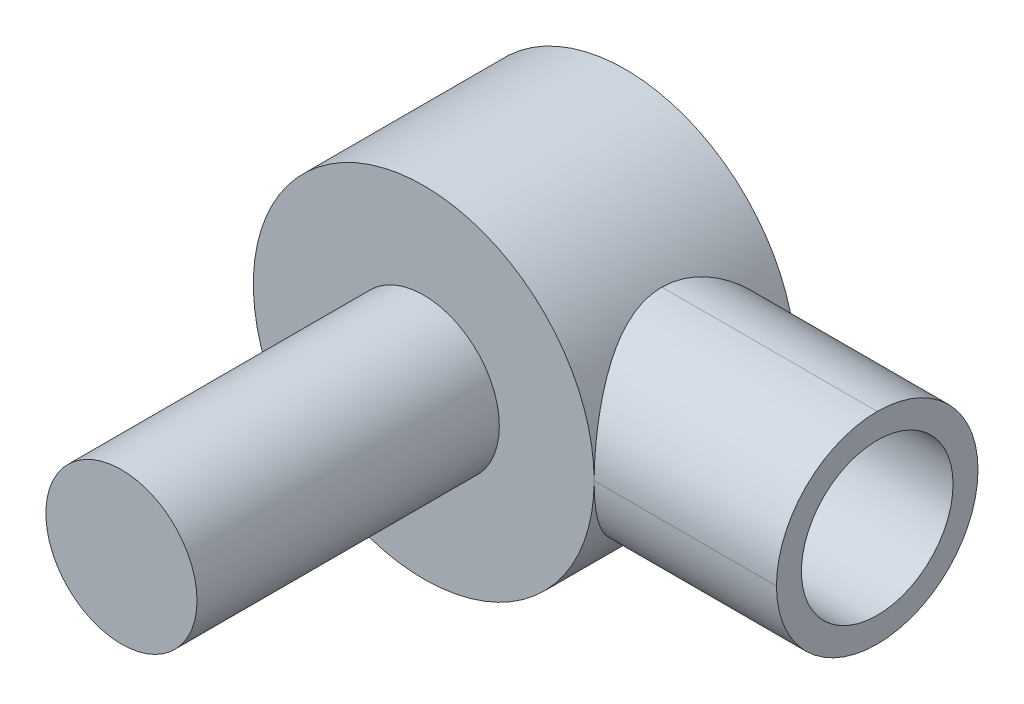
ISO-10303-21;
HEADER;
FILE_DESCRIPTION(('STEP AP214'),'2;1');
FILE_NAME('part.step','',(''),(''),'','','');
FILE_SCHEMA(('AUTOMOTIVE_DESIGN { 1 0 10303 214 1 1 1 1 }'));
ENDSEC;
DATA;
#1=APPLICATION_CONTEXT('core data for automotive mechanical design processes');
#2=APPLICATION_PROTOCOL_DEFINITION('international standard','automotive_design',2000,#1);
#3=PRODUCT_CONTEXT('',#1,'mechanical');
#4=PRODUCT('Part','Part','',(#3));
#5=PRODUCT_RELATED_PRODUCT_CATEGORY('part','',(#4));
#6=PRODUCT_DEFINITION_FORMATION('','',#4);
#7=PRODUCT_DEFINITION_CONTEXT('part definition',#1,'design');
#8=PRODUCT_DEFINITION('design','',#6,#7);
#9=PRODUCT_DEFINITION_SHAPE('','',#8);
#10=(LENGTH_UNIT() NAMED_UNIT(*) SI_UNIT(.MILLI.,.METRE.));
#11=(NAMED_UNIT(*) PLANE_ANGLE_UNIT() SI_UNIT($,.RADIAN.));
#12=(NAMED_UNIT(*) SI_UNIT($,.STERADIAN.) SOLID_ANGLE_UNIT());
#13=UNCERTAINTY_MEASURE_WITH_UNIT(LENGTH_MEASURE(1.E-05),#10,'distance_accuracy_value','');
#14=(GEOMETRIC_REPRESENTATION_CONTEXT(3) GLOBAL_UNCERTAINTY_ASSIGNED_CONTEXT((#13)) GLOBAL_UNIT_ASSIGNED_CONTEXT((#10,
#11,#12)) REPRESENTATION_CONTEXT('',''));
#15=CARTESIAN_POINT('',(0.,0.,0.));
#16=DIRECTION('',(0.,0.,1.));
#17=DIRECTION('',(1.,0.,0.));
#18=AXIS2_PLACEMENT_3D('',#15,#16,#17);
#19=CARTESIAN_POINT('',(0.,0.,40.));
#20=DIRECTION('',(0.,0.,-1.));
#21=DIRECTION('',(-1.,0.,0.));
#22=AXIS2_PLACEMENT_3D('',#19,#20,#21);
#23=CYLINDRICAL_SURFACE('',#22,33.8186029261209);
#24=CARTESIAN_POINT('',(0.,0.,0.));
#25=DIRECTION('',(0.,0.,1.));
#26=DIRECTION('',(1.,0.,0.));
#27=AXIS2_PLACEMENT_3D('',#24,#25,#26);
#28=CIRCLE('',#27,33.8186029261209);
#29=CARTESIAN_POINT('',(33.8186029261209,0.,0.));
#30=VERTEX_POINT('',#29);
#31=EDGE_CURVE('E154',#30,#30,#28,.T.);
#32=ORIENTED_EDGE('',*,*,#31,.T.);
#33=CARTESIAN_POINT('',(33.8186029261209,0.,0.));
#34=CARTESIAN_POINT('',(33.8186063139391,-0.25776699889446,-1.88466073996932E-06));
#35=CARTESIAN_POINT('',(33.815654911843,-0.515498315282241,0.00498439253877558));
#36=CARTESIAN_POINT('',(33.8038815276497,-1.03043415682597,0.0249006114852887));
#37=CARTESIAN_POINT('',(33.7950597317006,-1.28763869842637,0.0398302379321435));
#38=CARTESIAN_POINT('',(33.7598641380628,-2.05742803039325,0.0994565403110367));
#39=CARTESIAN_POINT('',(33.7247600194719,-2.56856692445829,0.1589907422178));
#40=CARTESIAN_POINT('',(33.6324067464493,-3.57990496489912,0.316380231148131));
#41=CARTESIAN_POINT('',(33.575279154111,-4.08014851001001,0.414025195806914));
#42=CARTESIAN_POINT('',(33.4402600171058,-5.06912059187119,0.646395005441228));
#43=CARTESIAN_POINT('',(33.3623667849085,-5.55784818925737,0.781122864005987));
#44=CARTESIAN_POINT('',(33.1877834253281,-6.51978084000784,1.08580910333183));
#45=CARTESIAN_POINT('',(33.091124761791,-6.99301034786946,1.25570854337457));
#46=CARTESIAN_POINT('',(32.8810645415854,-7.92214483127294,1.62909044704063));
#47=CARTESIAN_POINT('',(32.7676630837697,-8.37804990908172,1.83257271238505));
#48=CARTESIAN_POINT('',(32.5263645156286,-9.27079072195125,2.27148845490724));
#49=CARTESIAN_POINT('',(32.3984527762947,-9.70760658603742,2.50695422533724));
#50=CARTESIAN_POINT('',(32.1307690735315,-10.5598832180313,3.00784812341752));
#51=CARTESIAN_POINT('',(31.9909965864533,-10.9753430417737,3.27327757412755));
#52=CARTESIAN_POINT('',(31.6915064867369,-11.8135014824101,3.85317831489119));
#53=CARTESIAN_POINT('',(31.5310786558176,-12.2344384329873,4.16982915988945));
#54=CARTESIAN_POINT('',(31.2030351308728,-13.0484131249434,4.833761094733));
#55=CARTESIAN_POINT('',(31.035419137841,-13.4414497039399,5.18104345939547));
#56=CARTESIAN_POINT('',(30.6963483785574,-14.1987473839189,5.90495464921777));
#57=CARTESIAN_POINT('',(30.524889053362,-14.562971706633,6.28161980121685));
#58=CARTESIAN_POINT('',(30.1820633322389,-15.260803164374,7.06237801452643));
#59=CARTESIAN_POINT('',(30.0106969420587,-15.5944085821224,7.46647261202433));
#60=CARTESIAN_POINT('',(29.6517530778015,-16.267567348724,8.3505084828866));
#61=CARTESIAN_POINT('',(29.4646820351066,-16.6030779430779,8.83374578839583));
#62=CARTESIAN_POINT('',(29.1014050650886,-17.2318900234099,9.83095616568657));
#63=CARTESIAN_POINT('',(28.9252007037354,-17.5251854339509,10.3449336464321));
#64=CARTESIAN_POINT('',(28.5904123848628,-18.0661880604738,11.3998168071126));
#65=CARTESIAN_POINT('',(28.4317777900834,-18.3140277131055,11.9406382316603));
#66=CARTESIAN_POINT('',(28.1380111629385,-18.7622530233496,13.0477193902187));
#67=CARTESIAN_POINT('',(28.0028724228477,-18.9626522304471,13.6139718057707));
#68=CARTESIAN_POINT('',(27.7863101370791,-19.2781703079288,14.6534328964886));
#69=CARTESIAN_POINT('',(27.699548896213,-19.4023211038447,15.1228000936451));
#70=CARTESIAN_POINT('',(27.5481852884861,-19.6166420157242,16.0726262582399));
#71=CARTESIAN_POINT('',(27.4835756945502,-19.7068232153717,16.5530815534309));
#72=CARTESIAN_POINT('',(27.378557666031,-19.8524732950242,17.5255950787775));
#73=CARTESIAN_POINT('',(27.33833014718,-19.9076828169868,18.0177125531445));
#74=CARTESIAN_POINT('',(27.2979208610966,-19.9630125973366,18.7591386489672));
#75=CARTESIAN_POINT('',(27.2877730001433,-19.9768751605122,19.0069774505578));
#76=CARTESIAN_POINT('',(27.2742210112628,-19.9953705234567,19.5031987405952));
#77=CARTESIAN_POINT('',(27.2708173153371,-20.0000027319701,19.7515812628501));
#78=CARTESIAN_POINT('',(27.2708251410666,-20.,20.));
#79=B_SPLINE_CURVE_WITH_KNOTS('',3,(#33,#34,#35,#36,#37,#38,#39,#40,#41,#42,#43,#44,#45,#46,#47,
#48,#49,#50,#51,#52,#53,#54,#55,#56,#57,#58,#59,#60,#61,#62,#63,#64,#65,#66,#67,#68,#69,#70,#71,
#72,#73,#74,#75,#76,#77,#78),.UNSPECIFIED.,.F.,.F.,(4,2,2,2,2,2,2,2,2,2,2,2,2,2,2,2,2,2,2,2,2,2,
4),(0.,0.773165214770627,1.54630591390868,3.09145624368039,4.62819723520834,6.16506314886758,
7.69937412632536,9.23367604526574,10.7695388031308,12.3054694042512,13.9556876723422,
15.6059746513603,17.2583352912175,18.9107885480857,20.7604760847301,22.6104295552646,
24.4549044074197,26.2988518210551,27.7767890913243,29.2542437179994,30.7425310146718,
31.4876018301169,32.2327203699625),.UNSPECIFIED.);
#80=CARTESIAN_POINT('',(27.2708251410666,-20.,20.));
#81=VERTEX_POINT('',#80);
#82=EDGE_CURVE('E51',#30,#81,#79,.T.);
#83=ORIENTED_EDGE('',*,*,#82,.T.);
#84=CARTESIAN_POINT('',(27.2708251410666,-20.,20.));
#85=CARTESIAN_POINT('',(27.2708115282266,-20.0000073233572,20.2537436016112));
#86=CARTESIAN_POINT('',(27.2743662838379,-19.9951712225496,20.507481450513));
#87=CARTESIAN_POINT('',(27.2885118520192,-19.9758676061996,21.0143775972179));
#88=CARTESIAN_POINT('',(27.2991021931013,-19.9614007360605,21.2675359327161));
#89=CARTESIAN_POINT('',(27.3272053645611,-19.9229086871384,21.7725071372583));
#90=CARTESIAN_POINT('',(27.344711827465,-19.8988923001883,22.0243210285676));
#91=CARTESIAN_POINT('',(27.3864464047122,-19.8414138645623,22.5262905712664));
#92=CARTESIAN_POINT('',(27.4106745916582,-19.8079517138607,22.7764462047148));
#93=CARTESIAN_POINT('',(27.4926461466494,-19.6941910283406,23.5197432003869));
#94=CARTESIAN_POINT('',(27.5599132367885,-19.6002002227865,24.0098359745086));
#95=CARTESIAN_POINT('',(27.717342127972,-19.3769296715116,24.97811959276));
#96=CARTESIAN_POINT('',(27.8075083141183,-19.2476431664238,25.4563081379889));
#97=CARTESIAN_POINT('',(28.0071594100242,-18.9559493738512,26.396350642611));
#98=CARTESIAN_POINT('',(28.1165744128303,-18.7936616170848,26.8582566860012));
#99=CARTESIAN_POINT('',(28.3514871204776,-18.4373690186328,27.7653665928241));
#100=CARTESIAN_POINT('',(28.4769843713376,-18.2433650722119,28.2105709272662));
#101=CARTESIAN_POINT('',(28.7408435530804,-17.8247896251393,29.0835962338778));
#102=CARTESIAN_POINT('',(28.8792318092712,-17.6001551187363,29.5113789514697));
#103=CARTESIAN_POINT('',(29.1652294004405,-17.1220587849712,30.3473184286224));
#104=CARTESIAN_POINT('',(29.3128397551433,-16.8685937671522,30.7554730089596));
#105=CARTESIAN_POINT('',(29.631689313486,-16.3027100860229,31.5977766357931));
#106=CARTESIAN_POINT('',(29.8036671852469,-15.9868637585118,32.0293463632246));
#107=CARTESIAN_POINT('',(30.1506950278238,-15.3223372393904,32.8651095030316));
#108=CARTESIAN_POINT('',(30.3257451776135,-14.9736551297507,33.2693013138129));
#109=CARTESIAN_POINT('',(30.6748915022836,-14.2447284695471,34.0489354497067));
#110=CARTESIAN_POINT('',(30.8489872784771,-13.8644716623362,34.4243665007362));
#111=CARTESIAN_POINT('',(31.1922583424306,-13.073892380573,35.1446128981693));
#112=CARTESIAN_POINT('',(31.3614334257222,-12.6635686591432,35.4894269735714));
#113=CARTESIAN_POINT('',(31.7084320247216,-11.7697273913774,36.1810199454718));
#114=CARTESIAN_POINT('',(31.8853000659109,-11.283047543529,36.5242077547018));
#115=CARTESIAN_POINT('',(32.223615720533,-10.2770668388292,37.167949608916));
#116=CARTESIAN_POINT('',(32.3850615425951,-9.75776220402501,37.4684987031551));
#117=CARTESIAN_POINT('',(32.6876059855482,-8.69053195681059,38.0231967186829));
#118=CARTESIAN_POINT('',(32.828741879366,-8.14266135383447,38.2774308716543));
#119=CARTESIAN_POINT('',(33.0867115962224,-7.02126322865272,38.7368284262491));
#120=CARTESIAN_POINT('',(33.2035517657777,-6.44774245445564,38.9420046448648));
#121=CARTESIAN_POINT('',(33.3888866754856,-5.39507621509767,39.2648287279545));
#122=CARTESIAN_POINT('',(33.4623716867518,-4.91963546663847,39.391758950467));
#123=CARTESIAN_POINT('',(33.5896575472743,-3.95825792909211,39.6105872467593));
#124=CARTESIAN_POINT('',(33.6434630692832,-3.47232366067413,39.7024936369126));
#125=CARTESIAN_POINT('',(33.7303764282521,-2.4906765444365,39.8505420675305));
#126=CARTESIAN_POINT('',(33.7633817768267,-1.99492750141638,39.9065070397478));
#127=CARTESIAN_POINT('',(33.7964710786717,-1.24846223527741,39.9625586302441));
#128=CARTESIAN_POINT('',(33.8047644212312,-0.99906455713327,39.9765932084778));
#129=CARTESIAN_POINT('',(33.8158319567523,-0.499788666486304,39.9953149147782));
#130=CARTESIAN_POINT('',(33.8186059762608,-0.249910439128488,40.0000017490779));
#131=CARTESIAN_POINT('',(33.8186029261209,0.,40.));
#132=B_SPLINE_CURVE_WITH_KNOTS('',3,(#84,#85,#86,#87,#88,#89,#90,#91,#92,#93,#94,#95,#96,#97,
#98,#99,#100,#101,#102,#103,#104,#105,#106,#107,#108,#109,#110,#111,#112,#113,#114,#115,#116,
#117,#118,#119,#120,#121,#122,#123,#124,#125,#126,#127,#128,#129,#130,#131),.UNSPECIFIED.,.F.,
.F.,(4,2,2,2,2,2,2,2,2,2,2,2,2,2,2,2,2,2,2,2,2,2,2,4),(0.,0.761149801873973,1.5222486006421,
2.2826483046295,3.04305622216349,4.55149762812459,6.06022811378575,7.56358830748777,
9.06690607260863,10.5733641042711,12.0799890068562,13.7636118352679,15.447333069846,
17.131710973438,18.8161587679009,20.6773735625232,22.5388042846645,24.3967740964242,
26.2542579588753,27.7452693266807,29.2359264344242,30.733872160278,31.4834567603645,
32.2330649169247),.UNSPECIFIED.);
#133=CARTESIAN_POINT('',(33.8186029261209,0.,40.));
#134=VERTEX_POINT('',#133);
#135=EDGE_CURVE('E109',#81,#134,#132,.T.);
#136=ORIENTED_EDGE('',*,*,#135,.T.);
#137=CARTESIAN_POINT('',(0.,0.,40.));
#138=DIRECTION('',(0.,0.,1.));
#139=DIRECTION('',(1.,0.,0.));
#140=AXIS2_PLACEMENT_3D('',#137,#138,#139);
#141=CIRCLE('',#140,33.8186029261209);
#142=EDGE_CURVE('E158',#134,#134,#141,.T.);
#143=ORIENTED_EDGE('',*,*,#142,.F.);
#144=CARTESIAN_POINT('',(33.8186029261209,0.,40.));
#145=CARTESIAN_POINT('',(33.8186063139391,0.257766998894465,40.0000018846607));
#146=CARTESIAN_POINT('',(33.815654911843,0.515498315282246,39.9950156074612));
#147=CARTESIAN_POINT('',(33.8038815276497,1.03043415682598,39.9750993885147));
#148=CARTESIAN_POINT('',(33.7950597317006,1.28763869842638,39.9601697620679));
#149=CARTESIAN_POINT('',(33.7598641380628,2.05742803039325,39.900543459689));
#150=CARTESIAN_POINT('',(33.7247600194719,2.5685669244583,39.8410092577822));
#151=CARTESIAN_POINT('',(33.6324067464493,3.57990496489913,39.6836197688519));
#152=CARTESIAN_POINT('',(33.575279154111,4.08014851001001,39.5859748041931));
#153=CARTESIAN_POINT('',(33.4402600171058,5.06912059187119,39.3536049945588));
#154=CARTESIAN_POINT('',(33.3623667849085,5.55784818925738,39.218877135994));
#155=CARTESIAN_POINT('',(33.1877834253281,6.51978084000785,38.9141908966682));
#156=CARTESIAN_POINT('',(33.091124761791,6.99301034786947,38.7442914566254));
#157=CARTESIAN_POINT('',(32.8810645415854,7.92214483127294,38.3709095529594));
#158=CARTESIAN_POINT('',(32.7676630837697,8.37804990908173,38.1674272876149));
#159=CARTESIAN_POINT('',(32.5263645156286,9.27079072195126,37.7285115450928));
#160=CARTESIAN_POINT('',(32.3984527762947,9.70760658603743,37.4930457746628));
#161=CARTESIAN_POINT('',(32.1307690735315,10.5598832180313,36.9921518765825));
#162=CARTESIAN_POINT('',(31.9909965864533,10.9753430417737,36.7267224258725));
#163=CARTESIAN_POINT('',(31.6915064867369,11.8135014824101,36.1468216851088));
#164=CARTESIAN_POINT('',(31.5310786558176,12.2344384329873,35.8301708401105));
#165=CARTESIAN_POINT('',(31.2030351308728,13.0484131249434,35.166238905267));
#166=CARTESIAN_POINT('',(31.035419137841,13.4414497039399,34.8189565406045));
#167=CARTESIAN_POINT('',(30.6963483785574,14.1987473839189,34.0950453507822));
#168=CARTESIAN_POINT('',(30.524889053362,14.562971706633,33.7183801987832));
#169=CARTESIAN_POINT('',(30.1820633322389,15.260803164374,32.9376219854736));
#170=CARTESIAN_POINT('',(30.0106969420588,15.5944085821224,32.5335273879757));
#171=CARTESIAN_POINT('',(29.6517530778015,16.267567348724,31.6494915171134));
#172=CARTESIAN_POINT('',(29.4646820351066,16.6030779430779,31.1662542116042));
#173=CARTESIAN_POINT('',(29.1014050650886,17.2318900234099,30.1690438343134));
#174=CARTESIAN_POINT('',(28.9252007037354,17.5251854339509,29.6550663535679));
#175=CARTESIAN_POINT('',(28.5904123848628,18.0661880604738,28.6001831928874));
#176=CARTESIAN_POINT('',(28.4317777900834,18.3140277131055,28.0593617683397));
#177=CARTESIAN_POINT('',(28.1380111629385,18.7622530233496,26.9522806097813));
#178=CARTESIAN_POINT('',(28.0028724228477,18.9626522304471,26.3860281942293));
#179=CARTESIAN_POINT('',(27.7863101370791,19.2781703079288,25.3465671035114));
#180=CARTESIAN_POINT('',(27.699548896213,19.4023211038447,24.877199906355));
#181=CARTESIAN_POINT('',(27.5481852884861,19.6166420157242,23.9273737417601));
#182=CARTESIAN_POINT('',(27.4835756945502,19.7068232153717,23.4469184465691));
#183=CARTESIAN_POINT('',(27.378557666031,19.8524732950242,22.4744049212225));
#184=CARTESIAN_POINT('',(27.33833014718,19.9076828169868,21.9822874468555));
#185=CARTESIAN_POINT('',(27.2979208610966,19.9630125973366,21.2408613510328));
#186=CARTESIAN_POINT('',(27.2877730001433,19.9768751605122,20.9930225494422));
#187=CARTESIAN_POINT('',(27.2742210112628,19.9953705234567,20.4968012594048));
#188=CARTESIAN_POINT('',(27.2708173153371,20.0000027319701,20.2484187371499));
#189=CARTESIAN_POINT('',(27.2708251410666,20.,20.));
#190=B_SPLINE_CURVE_WITH_KNOTS('',3,(#144,#145,#146,#147,#148,#149,#150,#151,#152,#153,#154,
#155,#156,#157,#158,#159,#160,#161,#162,#163,#164,#165,#166,#167,#168,#169,#170,#171,#172,#173,
#174,#175,#176,#177,#178,#179,#180,#181,#182,#183,#184,#185,#186,#187,#188,#189),.UNSPECIFIED.,
.F.,.F.,(4,2,2,2,2,2,2,2,2,2,2,2,2,2,2,2,2,2,2,2,2,2,4),(0.,0.773165214770628,1.54630591390869,
3.09145624368039,4.62819723520834,6.16506314886758,7.69937412632536,9.23367604526574,
10.7695388031308,12.3054694042512,13.9556876723422,15.6059746513603,17.2583352912175,
18.9107885480857,20.7604760847301,22.6104295552646,24.4549044074197,26.2988518210551,
27.7767890913243,29.2542437179994,30.7425310146718,31.487601830117,32.2327203699625),.UNSPECIFIED.);
#191=CARTESIAN_POINT('',(27.2708251410666,20.,20.));
#192=VERTEX_POINT('',#191);
#193=EDGE_CURVE('E92',#134,#192,#190,.T.);
#194=ORIENTED_EDGE('',*,*,#193,.T.);
#195=CARTESIAN_POINT('',(27.2708251410666,20.,20.));
#196=CARTESIAN_POINT('',(27.2708115282266,20.0000073233572,19.7462563983889));
#197=CARTESIAN_POINT('',(27.2743662838379,19.9951712225496,19.492518549487));
#198=CARTESIAN_POINT('',(27.2885118520192,19.9758676061996,18.9856224027821));
#199=CARTESIAN_POINT('',(27.2991021931013,19.9614007360605,18.7324640672839));
#200=CARTESIAN_POINT('',(27.3272053645611,19.9229086871384,18.2274928627417));
#201=CARTESIAN_POINT('',(27.344711827465,19.8988923001883,17.9756789714324));
#202=CARTESIAN_POINT('',(27.3864464047122,19.8414138645623,17.4737094287336));
#203=CARTESIAN_POINT('',(27.4106745916582,19.8079517138607,17.2235537952852));
#204=CARTESIAN_POINT('',(27.4926461466494,19.6941910283406,16.4802567996131));
#205=CARTESIAN_POINT('',(27.5599132367885,19.6002002227865,15.9901640254915));
#206=CARTESIAN_POINT('',(27.717342127972,19.3769296715116,15.02188040724));
#207=CARTESIAN_POINT('',(27.8075083141183,19.2476431664238,14.5436918620111));
#208=CARTESIAN_POINT('',(28.0071594100242,18.9559493738512,13.603649357389));
#209=CARTESIAN_POINT('',(28.1165744128303,18.7936616170848,13.1417433139988));
#210=CARTESIAN_POINT('',(28.3514871204776,18.4373690186328,12.2346334071759));
#211=CARTESIAN_POINT('',(28.4769843713376,18.2433650722119,11.7894290727338));
#212=CARTESIAN_POINT('',(28.7408435530804,17.8247896251393,10.9164037661222));
#213=CARTESIAN_POINT('',(28.8792318092712,17.6001551187363,10.4886210485303));
#214=CARTESIAN_POINT('',(29.1652294004405,17.1220587849712,9.65268157137755));
#215=CARTESIAN_POINT('',(29.3128397551433,16.8685937671522,9.24452699104042));
#216=CARTESIAN_POINT('',(29.631689313486,16.3027100860229,8.40222336420685));
#217=CARTESIAN_POINT('',(29.8036671852469,15.9868637585118,7.97065363677539));
#218=CARTESIAN_POINT('',(30.1506950278238,15.3223372393904,7.13489049696844));
#219=CARTESIAN_POINT('',(30.3257451776135,14.9736551297507,6.73069868618711));
#220=CARTESIAN_POINT('',(30.6748915022836,14.2447284695471,5.95106455029326));
#221=CARTESIAN_POINT('',(30.848987278477,13.8644716623362,5.57563349926381));
#222=CARTESIAN_POINT('',(31.1922583424306,13.073892380573,4.85538710183067));
#223=CARTESIAN_POINT('',(31.3614334257222,12.6635686591432,4.51057302642858));
#224=CARTESIAN_POINT('',(31.7084320247216,11.7697273913774,3.81898005452824));
#225=CARTESIAN_POINT('',(31.8853000659109,11.283047543529,3.47579224529819));
#226=CARTESIAN_POINT('',(32.223615720533,10.2770668388292,2.83205039108396));
#227=CARTESIAN_POINT('',(32.3850615425951,9.757762204025,2.53150129684489));
#228=CARTESIAN_POINT('',(32.6876059855482,8.69053195681058,1.97680328131704));
#229=CARTESIAN_POINT('',(32.828741879366,8.14266135383446,1.72256912834571));
#230=CARTESIAN_POINT('',(33.0867115962224,7.02126322865271,1.26317157375089));
#231=CARTESIAN_POINT('',(33.2035517657777,6.44774245445563,1.05799535513515));
#232=CARTESIAN_POINT('',(33.3888866754856,5.39507621509767,0.735171272045491));
#233=CARTESIAN_POINT('',(33.4623716867518,4.91963546663847,0.608241049533006));
#234=CARTESIAN_POINT('',(33.5896575472743,3.9582579290921,0.389412753240692));
#235=CARTESIAN_POINT('',(33.6434630692832,3.47232366067413,0.29750636308744));
#236=CARTESIAN_POINT('',(33.7303764282521,2.4906765444365,0.149457932469467));
#237=CARTESIAN_POINT('',(33.7633817768267,1.99492750141638,0.0934929602521831));
#238=CARTESIAN_POINT('',(33.7964710786717,1.24846223527741,0.0374413697558939));
#239=CARTESIAN_POINT('',(33.8047644212312,0.999064557133268,0.0234067915222462));
#240=CARTESIAN_POINT('',(33.8158319567523,0.499788666486303,0.00468508522175079));
#241=CARTESIAN_POINT('',(33.8186059762608,0.24991043912849,-1.74907791626342E-06));
#242=CARTESIAN_POINT('',(33.8186029261209,0.,0.));
#243=B_SPLINE_CURVE_WITH_KNOTS('',3,(#195,#196,#197,#198,#199,#200,#201,#202,#203,#204,#205,
#206,#207,#208,#209,#210,#211,#212,#213,#214,#215,#216,#217,#218,#219,#220,#221,#222,#223,#224,
#225,#226,#227,#228,#229,#230,#231,#232,#233,#234,#235,#236,#237,#238,#239,#240,#241,#242),
.UNSPECIFIED.,.F.,.F.,(4,2,2,2,2,2,2,2,2,2,2,2,2,2,2,2,2,2,2,2,2,2,2,4),(0.,0.761149801873969,
1.5222486006421,2.2826483046295,3.04305622216349,4.55149762812459,6.06022811378575,
7.56358830748777,9.06690607260864,10.5733641042711,12.0799890068562,13.763611835268,
15.447333069846,17.131710973438,18.8161587679009,20.6773735625232,22.5388042846645,
24.3967740964243,26.2542579588753,27.7452693266807,29.2359264344242,30.733872160278,
31.4834567603645,32.2330649169247),.UNSPECIFIED.);
#244=EDGE_CURVE('E11',#192,#30,#243,.T.);
#245=ORIENTED_EDGE('',*,*,#244,.T.);
#246=EDGE_LOOP('',(#32,#83,#136,#143,#194,#245));
#247=FACE_BOUND('',#246,.T.);
#248=ADVANCED_FACE('F41',(#247),#23,.T.);
#249=CARTESIAN_POINT('',(70.,-20.,40.));
#250=DIRECTION('',(-1.,0.,0.));
#251=DIRECTION('',(0.,0.,1.));
#252=AXIS2_PLACEMENT_3D('',#249,#250,#251);
#253=PLANE('',#252);
#254=CARTESIAN_POINT('',(70.,0.,20.));
#255=DIRECTION('',(1.,0.,0.));
#256=DIRECTION('',(0.,0.,-1.));
#257=AXIS2_PLACEMENT_3D('',#254,#255,#256);
#258=CIRCLE('',#257,15.05);
#259=CARTESIAN_POINT('',(70.,0.,4.95));
#260=VERTEX_POINT('',#259);
#261=EDGE_CURVE('E146',#260,#260,#258,.T.);
#262=ORIENTED_EDGE('',*,*,#261,.F.);
#263=EDGE_LOOP('',(#262));
#264=FACE_BOUND('',#263,.T.);
#265=CARTESIAN_POINT('',(70.,0.,20.));
#266=DIRECTION('',(-1.,0.,0.));
#267=DIRECTION('',(0.,0.,1.));
#268=AXIS2_PLACEMENT_3D('',#265,#266,#267);
#269=CIRCLE('',#268,20.);
#270=CARTESIAN_POINT('',(70.,0.,0.));
#271=VERTEX_POINT('',#270);
#272=CARTESIAN_POINT('',(70.,20.,20.));
#273=VERTEX_POINT('',#272);
#274=EDGE_CURVE('E107',#271,#273,#269,.F.);
#275=ORIENTED_EDGE('',*,*,#274,.T.);
#276=CARTESIAN_POINT('',(70.,0.,20.));
#277=DIRECTION('',(-1.,0.,0.));
#278=DIRECTION('',(0.,0.,1.));
#279=AXIS2_PLACEMENT_3D('',#276,#277,#278);
#280=CIRCLE('',#279,20.);
#281=CARTESIAN_POINT('',(70.,0.,40.));
#282=VERTEX_POINT('',#281);
#283=EDGE_CURVE('E90',#273,#282,#280,.F.);
#284=ORIENTED_EDGE('',*,*,#283,.T.);
#285=CARTESIAN_POINT('',(70.,0.,20.));
#286=DIRECTION('',(-1.,0.,0.));
#287=DIRECTION('',(0.,0.,1.));
#288=AXIS2_PLACEMENT_3D('',#285,#286,#287);
#289=CIRCLE('',#288,20.);
#290=CARTESIAN_POINT('',(70.,-20.,20.));
#291=VERTEX_POINT('',#290);
#292=EDGE_CURVE('E98',#282,#291,#289,.F.);
#293=ORIENTED_EDGE('',*,*,#292,.T.);
#294=CARTESIAN_POINT('',(70.,0.,20.));
#295=DIRECTION('',(-1.,0.,0.));
#296=DIRECTION('',(0.,0.,1.));
#297=AXIS2_PLACEMENT_3D('',#294,#295,#296);
#298=CIRCLE('',#297,20.);
#299=EDGE_CURVE('E103',#291,#271,#298,.F.);
#300=ORIENTED_EDGE('',*,*,#299,.T.);
#301=EDGE_LOOP('',(#275,#284,#293,#300));
#302=FACE_BOUND('',#301,.T.);
#303=ADVANCED_FACE('F105',(#264,#302),#253,.F.);
#304=CARTESIAN_POINT('',(0.,0.,40.));
#305=DIRECTION('',(0.,0.,1.));
#306=DIRECTION('',(1.,0.,0.));
#307=AXIS2_PLACEMENT_3D('',#304,#305,#306);
#308=PLANE('',#307);
#309=CARTESIAN_POINT('',(0.,0.,40.));
#310=DIRECTION('',(0.,0.,1.));
#311=DIRECTION('',(1.,0.,0.));
#312=AXIS2_PLACEMENT_3D('',#309,#310,#311);
#313=CIRCLE('',#312,15.);
#314=CARTESIAN_POINT('',(15.,0.,40.));
#315=VERTEX_POINT('',#314);
#316=EDGE_CURVE('E291',#315,#315,#313,.T.);
#317=ORIENTED_EDGE('',*,*,#316,.F.);
#318=EDGE_LOOP('',(#317));
#319=FACE_BOUND('',#318,.T.);
#320=ORIENTED_EDGE('',*,*,#142,.T.);
#321=EDGE_LOOP('',(#320));
#322=FACE_BOUND('',#321,.T.);
#323=ADVANCED_FACE('F164',(#319,#322),#308,.T.);
#324=CARTESIAN_POINT('',(0.,0.,0.));
#325=DIRECTION('',(0.,0.,1.));
#326=DIRECTION('',(1.,0.,0.));
#327=AXIS2_PLACEMENT_3D('',#324,#325,#326);
#328=PLANE('',#327);
#329=ORIENTED_EDGE('',*,*,#31,.F.);
#330=EDGE_LOOP('',(#329));
#331=FACE_BOUND('',#330,.T.);
#332=ADVANCED_FACE('F166',(#331),#328,.F.);
#333=CARTESIAN_POINT('',(30.,0.,20.));
#334=DIRECTION('',(1.,0.,0.));
#335=DIRECTION('',(0.,0.,-1.));
#336=AXIS2_PLACEMENT_3D('',#333,#334,#335);
#337=CYLINDRICAL_SURFACE('',#336,15.05);
#338=CARTESIAN_POINT('',(30.,0.,20.));
#339=DIRECTION('',(1.,0.,0.));
#340=DIRECTION('',(0.,0.,-1.));
#341=AXIS2_PLACEMENT_3D('',#338,#339,#340);
#342=CIRCLE('',#341,15.05);
#343=CARTESIAN_POINT('',(30.,0.,4.95));
#344=VERTEX_POINT('',#343);
#345=EDGE_CURVE('E149',#344,#344,#342,.T.);
#346=ORIENTED_EDGE('',*,*,#345,.F.);
#347=EDGE_LOOP('',(#346));
#348=FACE_BOUND('',#347,.T.);
#349=ORIENTED_EDGE('',*,*,#261,.T.);
#350=EDGE_LOOP('',(#349));
#351=FACE_BOUND('',#350,.T.);
#352=ADVANCED_FACE('F173',(#348,#351),#337,.F.);
#353=CARTESIAN_POINT('',(30.,0.,20.));
#354=DIRECTION('',(1.,0.,0.));
#355=DIRECTION('',(0.,0.,-1.));
#356=AXIS2_PLACEMENT_3D('',#353,#354,#355);
#357=PLANE('',#356);
#358=ORIENTED_EDGE('',*,*,#345,.T.);
#359=EDGE_LOOP('',(#358));
#360=FACE_BOUND('',#359,.T.);
#361=ADVANCED_FACE('F207',(#360),#357,.T.);
#362=CARTESIAN_POINT('',(27.2708251410666,0.,20.));
#363=DIRECTION('',(1.,0.,0.));
#364=DIRECTION('',(0.,0.,-1.));
#365=AXIS2_PLACEMENT_3D('',#362,#363,#364);
#366=CYLINDRICAL_SURFACE('',#365,20.);
#367=DIRECTION('',(1.,0.,0.));
#368=VECTOR('',#367,1.);
#369=CARTESIAN_POINT('',(27.2708251410666,-20.,20.));
#370=LINE('',#369,#368);
#371=EDGE_CURVE('E100',#81,#291,#370,.T.);
#372=ORIENTED_EDGE('',*,*,#371,.F.);
#373=ORIENTED_EDGE('',*,*,#82,.F.);
#374=DIRECTION('',(1.,0.,0.));
#375=VECTOR('',#374,1.);
#376=CARTESIAN_POINT('',(0.,0.,0.));
#377=LINE('',#376,#375);
#378=EDGE_CURVE('E46',#271,#30,#377,.F.);
#379=ORIENTED_EDGE('',*,*,#378,.F.);
#380=ORIENTED_EDGE('',*,*,#299,.F.);
#381=EDGE_LOOP('',(#372,#373,#379,#380));
#382=FACE_BOUND('',#381,.T.);
#383=ADVANCED_FACE('F43',(#382),#366,.T.);
#384=CARTESIAN_POINT('',(70.,0.,20.));
#385=DIRECTION('',(-1.,0.,0.));
#386=DIRECTION('',(0.,-1.,0.));
#387=AXIS2_PLACEMENT_3D('',#384,#385,#386);
#388=CYLINDRICAL_SURFACE('',#387,20.);
#389=ORIENTED_EDGE('',*,*,#378,.T.);
#390=ORIENTED_EDGE('',*,*,#244,.F.);
#391=DIRECTION('',(-1.,0.,0.));
#392=VECTOR('',#391,1.);
#393=CARTESIAN_POINT('',(70.,20.,20.));
#394=LINE('',#393,#392);
#395=EDGE_CURVE('E66',#273,#192,#394,.T.);
#396=ORIENTED_EDGE('',*,*,#395,.F.);
#397=ORIENTED_EDGE('',*,*,#274,.F.);
#398=EDGE_LOOP('',(#389,#390,#396,#397));
#399=FACE_BOUND('',#398,.T.);
#400=ADVANCED_FACE('F132',(#399),#388,.T.);
#401=CARTESIAN_POINT('',(0.,0.,20.));
#402=DIRECTION('',(-1.,0.,0.));
#403=DIRECTION('',(0.,0.,1.));
#404=AXIS2_PLACEMENT_3D('',#401,#402,#403);
#405=CYLINDRICAL_SURFACE('',#404,20.);
#406=ORIENTED_EDGE('',*,*,#371,.T.);
#407=ORIENTED_EDGE('',*,*,#292,.F.);
#408=DIRECTION('',(1.,0.,0.));
#409=VECTOR('',#408,1.);
#410=CARTESIAN_POINT('',(70.,0.,40.));
#411=LINE('',#410,#409);
#412=EDGE_CURVE('E86',#134,#282,#411,.T.);
#413=ORIENTED_EDGE('',*,*,#412,.F.);
#414=ORIENTED_EDGE('',*,*,#135,.F.);
#415=EDGE_LOOP('',(#406,#407,#413,#414));
#416=FACE_BOUND('',#415,.T.);
#417=ADVANCED_FACE('F99',(#416),#405,.T.);
#418=CARTESIAN_POINT('',(0.,0.,20.));
#419=DIRECTION('',(1.,0.,0.));
#420=DIRECTION('',(0.,1.,0.));
#421=AXIS2_PLACEMENT_3D('',#418,#419,#420);
#422=CYLINDRICAL_SURFACE('',#421,20.);
#423=ORIENTED_EDGE('',*,*,#283,.F.);
#424=ORIENTED_EDGE('',*,*,#395,.T.);
#425=ORIENTED_EDGE('',*,*,#193,.F.);
#426=ORIENTED_EDGE('',*,*,#412,.T.);
#427=EDGE_LOOP('',(#423,#424,#425,#426));
#428=FACE_BOUND('',#427,.T.);
#429=ADVANCED_FACE('F88',(#428),#422,.T.);
#430=CARTESIAN_POINT('',(0.,0.,100.));
#431=DIRECTION('',(0.,0.,-1.));
#432=DIRECTION('',(-1.,0.,0.));
#433=AXIS2_PLACEMENT_3D('',#430,#431,#432);
#434=CYLINDRICAL_SURFACE('',#433,15.);
#435=CARTESIAN_POINT('',(0.,0.,100.));
#436=DIRECTION('',(0.,0.,1.));
#437=DIRECTION('',(1.,0.,0.));
#438=AXIS2_PLACEMENT_3D('',#435,#436,#437);
#439=CIRCLE('',#438,15.);
#440=CARTESIAN_POINT('',(15.,0.,100.));
#441=VERTEX_POINT('',#440);
#442=EDGE_CURVE('E95',#441,#441,#439,.T.);
#443=ORIENTED_EDGE('',*,*,#442,.F.);
#444=EDGE_LOOP('',(#443));
#445=FACE_BOUND('',#444,.T.);
#446=ORIENTED_EDGE('',*,*,#316,.T.);
#447=EDGE_LOOP('',(#446));
#448=FACE_BOUND('',#447,.T.);
#449=ADVANCED_FACE('F129',(#445,#448),#434,.T.);
#450=CARTESIAN_POINT('',(0.,0.,100.));
#451=DIRECTION('',(0.,0.,1.));
#452=DIRECTION('',(1.,0.,0.));
#453=AXIS2_PLACEMENT_3D('',#450,#451,#452);
#454=PLANE('',#453);
#455=ORIENTED_EDGE('',*,*,#442,.T.);
#456=EDGE_LOOP('',(#455));
#457=FACE_BOUND('',#456,.T.);
#458=ADVANCED_FACE('F243',(#457),#454,.T.);
#459=CLOSED_SHELL('',(#248,#303,#323,#332,#352,#361,#383,#400,#417,#429,#449,#458));
#460=MANIFOLD_SOLID_BREP('B2',#459);
#461=ADVANCED_BREP_SHAPE_REPRESENTATION('',(#18,#460),#14);
#462=SHAPE_DEFINITION_REPRESENTATION(#9,#461);
ENDSEC;
END-ISO-10303-21;
